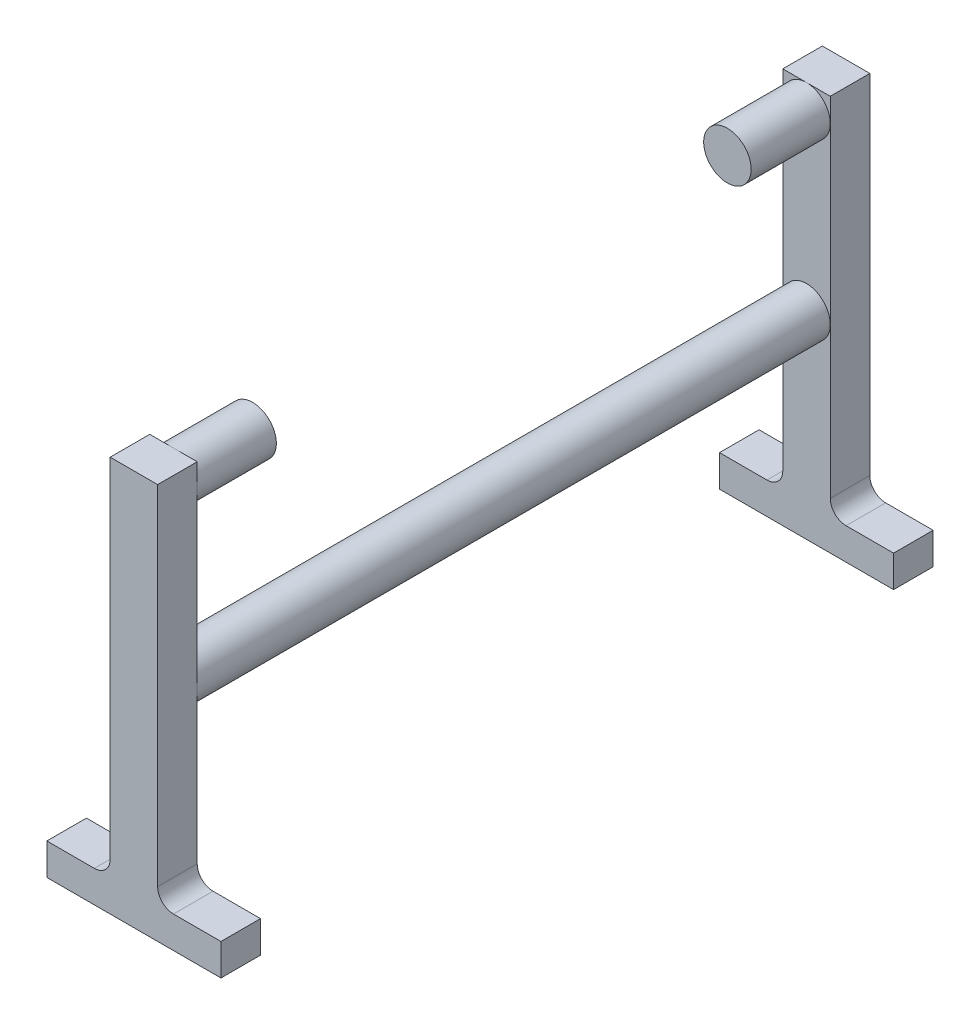
ISO-10303-21;
HEADER;
FILE_DESCRIPTION(('STEP AP214'),'2;1');
FILE_NAME('part.step','',(''),(''),'','','');
FILE_SCHEMA(('AUTOMOTIVE_DESIGN { 1 0 10303 214 1 1 1 1 }'));
ENDSEC;
DATA;
#1=APPLICATION_CONTEXT('core data for automotive mechanical design processes');
#2=APPLICATION_PROTOCOL_DEFINITION('international standard','automotive_design',2000,#1);
#3=PRODUCT_CONTEXT('',#1,'mechanical');
#4=PRODUCT('Part','Part','',(#3));
#5=PRODUCT_RELATED_PRODUCT_CATEGORY('part','',(#4));
#6=PRODUCT_DEFINITION_FORMATION('','',#4);
#7=PRODUCT_DEFINITION_CONTEXT('part definition',#1,'design');
#8=PRODUCT_DEFINITION('design','',#6,#7);
#9=PRODUCT_DEFINITION_SHAPE('','',#8);
#10=(LENGTH_UNIT() NAMED_UNIT(*) SI_UNIT(.MILLI.,.METRE.));
#11=(NAMED_UNIT(*) PLANE_ANGLE_UNIT() SI_UNIT($,.RADIAN.));
#12=(NAMED_UNIT(*) SI_UNIT($,.STERADIAN.) SOLID_ANGLE_UNIT());
#13=UNCERTAINTY_MEASURE_WITH_UNIT(LENGTH_MEASURE(1.E-05),#10,'distance_accuracy_value','');
#14=(GEOMETRIC_REPRESENTATION_CONTEXT(3) GLOBAL_UNCERTAINTY_ASSIGNED_CONTEXT((#13)) GLOBAL_UNIT_ASSIGNED_CONTEXT((#10,
#11,#12)) REPRESENTATION_CONTEXT('',''));
#15=CARTESIAN_POINT('',(0.,0.,0.));
#16=DIRECTION('',(0.,0.,1.));
#17=DIRECTION('',(1.,0.,0.));
#18=AXIS2_PLACEMENT_3D('',#15,#16,#17);
#19=CARTESIAN_POINT('',(0.,0.,-40.));
#20=DIRECTION('',(0.,0.,-1.));
#21=DIRECTION('',(1.,0.,0.));
#22=AXIS2_PLACEMENT_3D('',#19,#20,#21);
#23=PLANE('',#22);
#24=DIRECTION('',(0.,-1.,0.));
#25=VECTOR('',#24,1.);
#26=CARTESIAN_POINT('',(-3.,-25.,-40.));
#27=LINE('',#26,#25);
#28=CARTESIAN_POINT('',(-3.,25.,-40.));
#29=VERTEX_POINT('',#28);
#30=CARTESIAN_POINT('',(-3.,22.,-40.));
#31=VERTEX_POINT('',#30);
#32=EDGE_CURVE('E216',#29,#31,#27,.T.);
#33=ORIENTED_EDGE('',*,*,#32,.T.);
#34=CARTESIAN_POINT('',(0.,22.,-40.));
#35=DIRECTION('',(0.,0.,-1.));
#36=DIRECTION('',(-1.,0.,0.));
#37=AXIS2_PLACEMENT_3D('',#34,#35,#36);
#38=CIRCLE('',#37,3.);
#39=CARTESIAN_POINT('',(0.,25.,-40.));
#40=VERTEX_POINT('',#39);
#41=EDGE_CURVE('E54',#31,#40,#38,.T.);
#42=ORIENTED_EDGE('',*,*,#41,.T.);
#43=DIRECTION('',(-1.,0.,0.));
#44=VECTOR('',#43,1.);
#45=CARTESIAN_POINT('',(3.,25.,-40.));
#46=LINE('',#45,#44);
#47=EDGE_CURVE('E213',#40,#29,#46,.T.);
#48=ORIENTED_EDGE('',*,*,#47,.T.);
#49=EDGE_LOOP('',(#33,#42,#48));
#50=FACE_BOUND('',#49,.T.);
#51=ADVANCED_FACE('F39',(#50),#23,.F.);
#52=CARTESIAN_POINT('',(3.,25.,-40.));
#53=VERTEX_POINT('',#52);
#54=EDGE_CURVE('E222',#53,#40,#46,.T.);
#55=ORIENTED_EDGE('',*,*,#54,.T.);
#56=CARTESIAN_POINT('',(3.,22.,-40.));
#57=VERTEX_POINT('',#56);
#58=EDGE_CURVE('E203',#40,#57,#38,.T.);
#59=ORIENTED_EDGE('',*,*,#58,.T.);
#60=DIRECTION('',(0.,1.,0.));
#61=VECTOR('',#60,1.);
#62=CARTESIAN_POINT('',(3.,-25.,-40.));
#63=LINE('',#62,#61);
#64=EDGE_CURVE('E227',#57,#53,#63,.T.);
#65=ORIENTED_EDGE('',*,*,#64,.T.);
#66=EDGE_LOOP('',(#55,#59,#65));
#67=FACE_BOUND('',#66,.T.);
#68=ADVANCED_FACE('F226',(#67),#23,.F.);
#69=CARTESIAN_POINT('',(-3.,-25.,-45.));
#70=DIRECTION('',(-1.,0.,0.));
#71=DIRECTION('',(0.,0.,1.));
#72=AXIS2_PLACEMENT_3D('',#69,#70,#71);
#73=PLANE('',#72);
#74=DIRECTION('',(0.,-1.,0.));
#75=VECTOR('',#74,1.);
#76=CARTESIAN_POINT('',(-3.,-25.,-45.));
#77=LINE('',#76,#75);
#78=CARTESIAN_POINT('',(-3.,25.,-45.));
#79=VERTEX_POINT('',#78);
#80=CARTESIAN_POINT('',(-3.,-19.,-45.));
#81=VERTEX_POINT('',#80);
#82=EDGE_CURVE('E237',#79,#81,#77,.T.);
#83=ORIENTED_EDGE('',*,*,#82,.T.);
#84=DIRECTION('',(0.,0.,1.));
#85=VECTOR('',#84,1.);
#86=CARTESIAN_POINT('',(-3.,-19.,-45.));
#87=LINE('',#86,#85);
#88=CARTESIAN_POINT('',(-3.,-19.,-40.));
#89=VERTEX_POINT('',#88);
#90=EDGE_CURVE('E338',#81,#89,#87,.T.);
#91=ORIENTED_EDGE('',*,*,#90,.T.);
#92=CARTESIAN_POINT('',(-3.,0.,-40.));
#93=VERTEX_POINT('',#92);
#94=EDGE_CURVE('E377',#93,#89,#27,.T.);
#95=ORIENTED_EDGE('',*,*,#94,.F.);
#96=EDGE_CURVE('E825',#31,#93,#27,.T.);
#97=ORIENTED_EDGE('',*,*,#96,.F.);
#98=ORIENTED_EDGE('',*,*,#32,.F.);
#99=DIRECTION('',(0.,0.,1.));
#100=VECTOR('',#99,1.);
#101=CARTESIAN_POINT('',(-3.,25.,-45.));
#102=LINE('',#101,#100);
#103=EDGE_CURVE('E224',#79,#29,#102,.T.);
#104=ORIENTED_EDGE('',*,*,#103,.F.);
#105=EDGE_LOOP('',(#83,#91,#95,#97,#98,#104));
#106=FACE_BOUND('',#105,.T.);
#107=ADVANCED_FACE('F364',(#106),#73,.T.);
#108=CARTESIAN_POINT('',(3.,-25.,-45.));
#109=DIRECTION('',(1.,0.,0.));
#110=DIRECTION('',(0.,0.,-1.));
#111=AXIS2_PLACEMENT_3D('',#108,#109,#110);
#112=PLANE('',#111);
#113=CARTESIAN_POINT('',(3.,-19.,-40.));
#114=VERTEX_POINT('',#113);
#115=CARTESIAN_POINT('',(3.,0.,-40.));
#116=VERTEX_POINT('',#115);
#117=EDGE_CURVE('E231',#114,#116,#63,.T.);
#118=ORIENTED_EDGE('',*,*,#117,.F.);
#119=DIRECTION('',(0.,0.,-1.));
#120=VECTOR('',#119,1.);
#121=CARTESIAN_POINT('',(3.,-19.,-45.));
#122=LINE('',#121,#120);
#123=CARTESIAN_POINT('',(3.,-19.,-45.));
#124=VERTEX_POINT('',#123);
#125=EDGE_CURVE('E343',#114,#124,#122,.T.);
#126=ORIENTED_EDGE('',*,*,#125,.T.);
#127=DIRECTION('',(0.,1.,0.));
#128=VECTOR('',#127,1.);
#129=CARTESIAN_POINT('',(3.,-25.,-45.));
#130=LINE('',#129,#128);
#131=CARTESIAN_POINT('',(3.,25.,-45.));
#132=VERTEX_POINT('',#131);
#133=EDGE_CURVE('E406',#124,#132,#130,.T.);
#134=ORIENTED_EDGE('',*,*,#133,.T.);
#135=DIRECTION('',(0.,0.,1.));
#136=VECTOR('',#135,1.);
#137=CARTESIAN_POINT('',(3.,25.,-45.));
#138=LINE('',#137,#136);
#139=EDGE_CURVE('E238',#132,#53,#138,.T.);
#140=ORIENTED_EDGE('',*,*,#139,.T.);
#141=ORIENTED_EDGE('',*,*,#64,.F.);
#142=EDGE_CURVE('E229',#116,#57,#63,.T.);
#143=ORIENTED_EDGE('',*,*,#142,.F.);
#144=EDGE_LOOP('',(#118,#126,#134,#140,#141,#143));
#145=FACE_BOUND('',#144,.T.);
#146=ADVANCED_FACE('F465',(#145),#112,.T.);
#147=CARTESIAN_POINT('',(0.,0.,40.));
#148=DIRECTION('',(0.,0.,1.));
#149=DIRECTION('',(1.,0.,0.));
#150=AXIS2_PLACEMENT_3D('',#147,#148,#149);
#151=PLANE('',#150);
#152=CARTESIAN_POINT('',(0.,22.,40.));
#153=DIRECTION('',(0.,0.,-1.));
#154=DIRECTION('',(-1.,0.,0.));
#155=AXIS2_PLACEMENT_3D('',#152,#153,#154);
#156=CIRCLE('',#155,3.);
#157=CARTESIAN_POINT('',(3.,22.,40.));
#158=VERTEX_POINT('',#157);
#159=CARTESIAN_POINT('',(-3.,22.,40.));
#160=VERTEX_POINT('',#159);
#161=EDGE_CURVE('E242',#158,#160,#156,.T.);
#162=ORIENTED_EDGE('',*,*,#161,.F.);
#163=DIRECTION('',(0.,1.,0.));
#164=VECTOR('',#163,1.);
#165=CARTESIAN_POINT('',(3.,-25.,40.));
#166=LINE('',#165,#164);
#167=CARTESIAN_POINT('',(3.,0.,40.));
#168=VERTEX_POINT('',#167);
#169=EDGE_CURVE('E304',#168,#158,#166,.T.);
#170=ORIENTED_EDGE('',*,*,#169,.F.);
#171=CARTESIAN_POINT('',(0.,0.,40.));
#172=DIRECTION('',(0.,0.,1.));
#173=DIRECTION('',(1.,0.,0.));
#174=AXIS2_PLACEMENT_3D('',#171,#172,#173);
#175=CIRCLE('',#174,3.);
#176=CARTESIAN_POINT('',(-3.,0.,40.));
#177=VERTEX_POINT('',#176);
#178=EDGE_CURVE('E313',#168,#177,#175,.T.);
#179=ORIENTED_EDGE('',*,*,#178,.T.);
#180=DIRECTION('',(0.,-1.,0.));
#181=VECTOR('',#180,1.);
#182=CARTESIAN_POINT('',(-3.,-25.,40.));
#183=LINE('',#182,#181);
#184=EDGE_CURVE('E298',#160,#177,#183,.T.);
#185=ORIENTED_EDGE('',*,*,#184,.F.);
#186=EDGE_LOOP('',(#162,#170,#179,#185));
#187=FACE_BOUND('',#186,.T.);
#188=ADVANCED_FACE('F630',(#187),#151,.F.);
#189=CARTESIAN_POINT('',(0.,25.,40.));
#190=VERTEX_POINT('',#189);
#191=EDGE_CURVE('E247',#160,#190,#156,.T.);
#192=ORIENTED_EDGE('',*,*,#191,.F.);
#193=CARTESIAN_POINT('',(-3.,25.,40.));
#194=VERTEX_POINT('',#193);
#195=EDGE_CURVE('E294',#194,#160,#183,.T.);
#196=ORIENTED_EDGE('',*,*,#195,.F.);
#197=DIRECTION('',(-1.,0.,0.));
#198=VECTOR('',#197,1.);
#199=CARTESIAN_POINT('',(3.,25.,40.));
#200=LINE('',#199,#198);
#201=EDGE_CURVE('E303',#190,#194,#200,.T.);
#202=ORIENTED_EDGE('',*,*,#201,.F.);
#203=EDGE_LOOP('',(#192,#196,#202));
#204=FACE_BOUND('',#203,.T.);
#205=ADVANCED_FACE('F655',(#204),#151,.F.);
#206=CARTESIAN_POINT('',(-3.,-25.,45.));
#207=DIRECTION('',(1.,0.,0.));
#208=DIRECTION('',(0.,0.,-1.));
#209=AXIS2_PLACEMENT_3D('',#206,#207,#208);
#210=PLANE('',#209);
#211=CARTESIAN_POINT('',(-3.,-19.,40.));
#212=VERTEX_POINT('',#211);
#213=EDGE_CURVE('E274',#177,#212,#183,.T.);
#214=ORIENTED_EDGE('',*,*,#213,.T.);
#215=DIRECTION('',(0.,0.,-1.));
#216=VECTOR('',#215,1.);
#217=CARTESIAN_POINT('',(-3.,-19.,45.));
#218=LINE('',#217,#216);
#219=CARTESIAN_POINT('',(-3.,-19.,45.));
#220=VERTEX_POINT('',#219);
#221=EDGE_CURVE('E323',#212,#220,#218,.F.);
#222=ORIENTED_EDGE('',*,*,#221,.T.);
#223=DIRECTION('',(0.,-1.,0.));
#224=VECTOR('',#223,1.);
#225=CARTESIAN_POINT('',(-3.,-25.,45.));
#226=LINE('',#225,#224);
#227=CARTESIAN_POINT('',(-3.,25.,45.));
#228=VERTEX_POINT('',#227);
#229=EDGE_CURVE('E283',#228,#220,#226,.T.);
#230=ORIENTED_EDGE('',*,*,#229,.F.);
#231=DIRECTION('',(0.,0.,-1.));
#232=VECTOR('',#231,1.);
#233=CARTESIAN_POINT('',(-3.,25.,45.));
#234=LINE('',#233,#232);
#235=EDGE_CURVE('E293',#228,#194,#234,.T.);
#236=ORIENTED_EDGE('',*,*,#235,.T.);
#237=ORIENTED_EDGE('',*,*,#195,.T.);
#238=ORIENTED_EDGE('',*,*,#184,.T.);
#239=EDGE_LOOP('',(#214,#222,#230,#236,#237,#238));
#240=FACE_BOUND('',#239,.T.);
#241=ADVANCED_FACE('F644',(#240),#210,.F.);
#242=CARTESIAN_POINT('',(3.,-25.,45.));
#243=DIRECTION('',(-1.,0.,0.));
#244=DIRECTION('',(0.,0.,1.));
#245=AXIS2_PLACEMENT_3D('',#242,#243,#244);
#246=PLANE('',#245);
#247=DIRECTION('',(0.,1.,0.));
#248=VECTOR('',#247,1.);
#249=CARTESIAN_POINT('',(3.,-25.,45.));
#250=LINE('',#249,#248);
#251=CARTESIAN_POINT('',(3.,-19.,45.));
#252=VERTEX_POINT('',#251);
#253=CARTESIAN_POINT('',(3.,25.,45.));
#254=VERTEX_POINT('',#253);
#255=EDGE_CURVE('E289',#252,#254,#250,.T.);
#256=ORIENTED_EDGE('',*,*,#255,.F.);
#257=DIRECTION('',(0.,0.,1.));
#258=VECTOR('',#257,1.);
#259=CARTESIAN_POINT('',(3.,-19.,40.));
#260=LINE('',#259,#258);
#261=CARTESIAN_POINT('',(3.,-19.,40.));
#262=VERTEX_POINT('',#261);
#263=EDGE_CURVE('E328',#252,#262,#260,.F.);
#264=ORIENTED_EDGE('',*,*,#263,.T.);
#265=EDGE_CURVE('E301',#262,#168,#166,.T.);
#266=ORIENTED_EDGE('',*,*,#265,.T.);
#267=ORIENTED_EDGE('',*,*,#169,.T.);
#268=CARTESIAN_POINT('',(3.,25.,40.));
#269=VERTEX_POINT('',#268);
#270=EDGE_CURVE('E300',#158,#269,#166,.T.);
#271=ORIENTED_EDGE('',*,*,#270,.T.);
#272=DIRECTION('',(0.,0.,-1.));
#273=VECTOR('',#272,1.);
#274=CARTESIAN_POINT('',(3.,25.,45.));
#275=LINE('',#274,#273);
#276=EDGE_CURVE('E309',#254,#269,#275,.T.);
#277=ORIENTED_EDGE('',*,*,#276,.F.);
#278=EDGE_LOOP('',(#256,#264,#266,#267,#271,#277));
#279=FACE_BOUND('',#278,.T.);
#280=ADVANCED_FACE('F639',(#279),#246,.F.);
#281=CARTESIAN_POINT('',(0.,0.,40.));
#282=DIRECTION('',(0.,0.,-1.));
#283=DIRECTION('',(-1.,0.,0.));
#284=AXIS2_PLACEMENT_3D('',#281,#282,#283);
#285=CYLINDRICAL_SURFACE('',#284,3.);
#286=ORIENTED_EDGE('',*,*,#178,.F.);
#287=EDGE_CURVE('E317',#177,#168,#175,.T.);
#288=ORIENTED_EDGE('',*,*,#287,.F.);
#289=EDGE_LOOP('',(#286,#288));
#290=FACE_BOUND('',#289,.T.);
#291=CARTESIAN_POINT('',(0.,0.,-40.));
#292=DIRECTION('',(0.,0.,1.));
#293=DIRECTION('',(1.,0.,0.));
#294=AXIS2_PLACEMENT_3D('',#291,#292,#293);
#295=CIRCLE('',#294,3.);
#296=EDGE_CURVE('E318',#116,#93,#295,.T.);
#297=ORIENTED_EDGE('',*,*,#296,.T.);
#298=EDGE_CURVE('E312',#93,#116,#295,.T.);
#299=ORIENTED_EDGE('',*,*,#298,.T.);
#300=EDGE_LOOP('',(#297,#299));
#301=FACE_BOUND('',#300,.T.);
#302=ADVANCED_FACE('F627',(#290,#301),#285,.T.);
#303=EDGE_CURVE('E250',#190,#158,#156,.T.);
#304=ORIENTED_EDGE('',*,*,#303,.F.);
#305=EDGE_CURVE('E287',#269,#190,#200,.T.);
#306=ORIENTED_EDGE('',*,*,#305,.F.);
#307=ORIENTED_EDGE('',*,*,#270,.F.);
#308=EDGE_LOOP('',(#304,#306,#307));
#309=FACE_BOUND('',#308,.T.);
#310=ADVANCED_FACE('F621',(#309),#151,.F.);
#311=DIRECTION('',(1.,0.,0.));
#312=VECTOR('',#311,1.);
#313=CARTESIAN_POINT('',(3.,-25.,40.));
#314=LINE('',#313,#312);
#315=CARTESIAN_POINT('',(-11.,-25.,40.));
#316=VERTEX_POINT('',#315);
#317=CARTESIAN_POINT('',(11.,-25.,40.));
#318=VERTEX_POINT('',#317);
#319=EDGE_CURVE('E297',#316,#318,#314,.T.);
#320=ORIENTED_EDGE('',*,*,#319,.F.);
#321=DIRECTION('',(0.,-1.,0.));
#322=VECTOR('',#321,1.);
#323=CARTESIAN_POINT('',(-11.,-21.,40.));
#324=LINE('',#323,#322);
#325=CARTESIAN_POINT('',(-11.,-21.,40.));
#326=VERTEX_POINT('',#325);
#327=EDGE_CURVE('E266',#326,#316,#324,.T.);
#328=ORIENTED_EDGE('',*,*,#327,.F.);
#329=DIRECTION('',(1.,0.,0.));
#330=VECTOR('',#329,1.);
#331=CARTESIAN_POINT('',(11.,-21.,40.));
#332=LINE('',#331,#330);
#333=CARTESIAN_POINT('',(-5.,-21.,40.));
#334=VERTEX_POINT('',#333);
#335=EDGE_CURVE('E256',#326,#334,#332,.T.);
#336=ORIENTED_EDGE('',*,*,#335,.T.);
#337=CARTESIAN_POINT('',(-5.,-19.,40.));
#338=DIRECTION('',(0.,0.,1.));
#339=DIRECTION('',(1.,0.,0.));
#340=AXIS2_PLACEMENT_3D('',#337,#338,#339);
#341=CIRCLE('',#340,2.);
#342=EDGE_CURVE('E330',#334,#212,#341,.T.);
#343=ORIENTED_EDGE('',*,*,#342,.T.);
#344=ORIENTED_EDGE('',*,*,#213,.F.);
#345=ORIENTED_EDGE('',*,*,#287,.T.);
#346=ORIENTED_EDGE('',*,*,#265,.F.);
#347=CARTESIAN_POINT('',(5.,-19.,40.));
#348=DIRECTION('',(0.,0.,1.));
#349=DIRECTION('',(1.,0.,0.));
#350=AXIS2_PLACEMENT_3D('',#347,#348,#349);
#351=CIRCLE('',#350,2.);
#352=CARTESIAN_POINT('',(5.,-21.,40.));
#353=VERTEX_POINT('',#352);
#354=EDGE_CURVE('E336',#262,#353,#351,.T.);
#355=ORIENTED_EDGE('',*,*,#354,.T.);
#356=CARTESIAN_POINT('',(11.,-21.,40.));
#357=VERTEX_POINT('',#356);
#358=EDGE_CURVE('E254',#353,#357,#332,.T.);
#359=ORIENTED_EDGE('',*,*,#358,.T.);
#360=DIRECTION('',(0.,-1.,0.));
#361=VECTOR('',#360,1.);
#362=CARTESIAN_POINT('',(11.,-21.,40.));
#363=LINE('',#362,#361);
#364=EDGE_CURVE('E278',#357,#318,#363,.T.);
#365=ORIENTED_EDGE('',*,*,#364,.T.);
#366=EDGE_LOOP('',(#320,#328,#336,#343,#344,#345,#346,#355,#359,#365));
#367=FACE_BOUND('',#366,.T.);
#368=ADVANCED_FACE('F626',(#367),#151,.F.);
#369=CARTESIAN_POINT('',(3.,-25.,45.));
#370=DIRECTION('',(0.,1.,0.));
#371=DIRECTION('',(0.,0.,1.));
#372=AXIS2_PLACEMENT_3D('',#369,#370,#371);
#373=PLANE('',#372);
#374=ORIENTED_EDGE('',*,*,#319,.T.);
#375=DIRECTION('',(0.,0.,1.));
#376=VECTOR('',#375,1.);
#377=CARTESIAN_POINT('',(11.,-25.,40.));
#378=LINE('',#377,#376);
#379=CARTESIAN_POINT('',(11.,-25.,45.));
#380=VERTEX_POINT('',#379);
#381=EDGE_CURVE('E255',#318,#380,#378,.T.);
#382=ORIENTED_EDGE('',*,*,#381,.T.);
#383=DIRECTION('',(1.,0.,0.));
#384=VECTOR('',#383,1.);
#385=CARTESIAN_POINT('',(3.,-25.,45.));
#386=LINE('',#385,#384);
#387=CARTESIAN_POINT('',(-11.,-25.,45.));
#388=VERTEX_POINT('',#387);
#389=EDGE_CURVE('E286',#388,#380,#386,.T.);
#390=ORIENTED_EDGE('',*,*,#389,.F.);
#391=DIRECTION('',(0.,0.,-1.));
#392=VECTOR('',#391,1.);
#393=CARTESIAN_POINT('',(-11.,-25.,40.));
#394=LINE('',#393,#392);
#395=EDGE_CURVE('E246',#388,#316,#394,.T.);
#396=ORIENTED_EDGE('',*,*,#395,.T.);
#397=EDGE_LOOP('',(#374,#382,#390,#396));
#398=FACE_BOUND('',#397,.T.);
#399=ADVANCED_FACE('F610',(#398),#373,.F.);
#400=CARTESIAN_POINT('',(3.,25.,45.));
#401=DIRECTION('',(0.,-1.,0.));
#402=DIRECTION('',(0.,0.,-1.));
#403=AXIS2_PLACEMENT_3D('',#400,#401,#402);
#404=PLANE('',#403);
#405=ORIENTED_EDGE('',*,*,#305,.T.);
#406=ORIENTED_EDGE('',*,*,#201,.T.);
#407=ORIENTED_EDGE('',*,*,#235,.F.);
#408=DIRECTION('',(-1.,0.,0.));
#409=VECTOR('',#408,1.);
#410=CARTESIAN_POINT('',(3.,25.,45.));
#411=LINE('',#410,#409);
#412=EDGE_CURVE('E291',#254,#228,#411,.T.);
#413=ORIENTED_EDGE('',*,*,#412,.F.);
#414=ORIENTED_EDGE('',*,*,#276,.T.);
#415=EDGE_LOOP('',(#405,#406,#407,#413,#414));
#416=FACE_BOUND('',#415,.T.);
#417=ADVANCED_FACE('F604',(#416),#404,.F.);
#418=CARTESIAN_POINT('',(0.,0.,45.));
#419=DIRECTION('',(0.,0.,1.));
#420=DIRECTION('',(1.,0.,0.));
#421=AXIS2_PLACEMENT_3D('',#418,#419,#420);
#422=PLANE('',#421);
#423=ORIENTED_EDGE('',*,*,#389,.T.);
#424=DIRECTION('',(0.,-1.,0.));
#425=VECTOR('',#424,1.);
#426=CARTESIAN_POINT('',(11.,-21.,45.));
#427=LINE('',#426,#425);
#428=CARTESIAN_POINT('',(11.,-21.,45.));
#429=VERTEX_POINT('',#428);
#430=EDGE_CURVE('E275',#429,#380,#427,.T.);
#431=ORIENTED_EDGE('',*,*,#430,.F.);
#432=DIRECTION('',(-1.,0.,0.));
#433=VECTOR('',#432,1.);
#434=CARTESIAN_POINT('',(11.,-21.,45.));
#435=LINE('',#434,#433);
#436=CARTESIAN_POINT('',(5.,-21.,45.));
#437=VERTEX_POINT('',#436);
#438=EDGE_CURVE('E263',#429,#437,#435,.T.);
#439=ORIENTED_EDGE('',*,*,#438,.T.);
#440=CARTESIAN_POINT('',(5.,-19.,45.));
#441=DIRECTION('',(0.,0.,1.));
#442=DIRECTION('',(1.,0.,0.));
#443=AXIS2_PLACEMENT_3D('',#440,#441,#442);
#444=CIRCLE('',#443,2.);
#445=EDGE_CURVE('E334',#437,#252,#444,.F.);
#446=ORIENTED_EDGE('',*,*,#445,.T.);
#447=ORIENTED_EDGE('',*,*,#255,.T.);
#448=ORIENTED_EDGE('',*,*,#412,.T.);
#449=ORIENTED_EDGE('',*,*,#229,.T.);
#450=CARTESIAN_POINT('',(-5.,-19.,45.));
#451=DIRECTION('',(0.,0.,1.));
#452=DIRECTION('',(1.,0.,0.));
#453=AXIS2_PLACEMENT_3D('',#450,#451,#452);
#454=CIRCLE('',#453,2.);
#455=CARTESIAN_POINT('',(-5.,-21.,45.));
#456=VERTEX_POINT('',#455);
#457=EDGE_CURVE('E332',#220,#456,#454,.F.);
#458=ORIENTED_EDGE('',*,*,#457,.T.);
#459=CARTESIAN_POINT('',(-11.,-21.,45.));
#460=VERTEX_POINT('',#459);
#461=EDGE_CURVE('E262',#456,#460,#435,.T.);
#462=ORIENTED_EDGE('',*,*,#461,.T.);
#463=DIRECTION('',(0.,-1.,0.));
#464=VECTOR('',#463,1.);
#465=CARTESIAN_POINT('',(-11.,-21.,45.));
#466=LINE('',#465,#464);
#467=EDGE_CURVE('E271',#460,#388,#466,.T.);
#468=ORIENTED_EDGE('',*,*,#467,.T.);
#469=EDGE_LOOP('',(#423,#431,#439,#446,#447,#448,#449,#458,#462,#468));
#470=FACE_BOUND('',#469,.T.);
#471=ADVANCED_FACE('F609',(#470),#422,.T.);
#472=CARTESIAN_POINT('',(11.,-21.,40.));
#473=DIRECTION('',(1.,0.,0.));
#474=DIRECTION('',(0.,0.,-1.));
#475=AXIS2_PLACEMENT_3D('',#472,#473,#474);
#476=PLANE('',#475);
#477=ORIENTED_EDGE('',*,*,#381,.F.);
#478=ORIENTED_EDGE('',*,*,#364,.F.);
#479=DIRECTION('',(0.,0.,1.));
#480=VECTOR('',#479,1.);
#481=CARTESIAN_POINT('',(11.,-21.,40.));
#482=LINE('',#481,#480);
#483=EDGE_CURVE('E259',#357,#429,#482,.T.);
#484=ORIENTED_EDGE('',*,*,#483,.T.);
#485=ORIENTED_EDGE('',*,*,#430,.T.);
#486=EDGE_LOOP('',(#477,#478,#484,#485));
#487=FACE_BOUND('',#486,.T.);
#488=ADVANCED_FACE('F718',(#487),#476,.T.);
#489=CARTESIAN_POINT('',(0.,-21.,0.));
#490=DIRECTION('',(0.,-1.,0.));
#491=DIRECTION('',(0.,0.,-1.));
#492=AXIS2_PLACEMENT_3D('',#489,#490,#491);
#493=PLANE('',#492);
#494=ORIENTED_EDGE('',*,*,#358,.F.);
#495=DIRECTION('',(0.,0.,1.));
#496=VECTOR('',#495,1.);
#497=CARTESIAN_POINT('',(5.,-21.,45.));
#498=LINE('',#497,#496);
#499=EDGE_CURVE('E325',#353,#437,#498,.T.);
#500=ORIENTED_EDGE('',*,*,#499,.T.);
#501=ORIENTED_EDGE('',*,*,#438,.F.);
#502=ORIENTED_EDGE('',*,*,#483,.F.);
#503=EDGE_LOOP('',(#494,#500,#501,#502));
#504=FACE_BOUND('',#503,.T.);
#505=ADVANCED_FACE('F707',(#504),#493,.F.);
#506=ORIENTED_EDGE('',*,*,#461,.F.);
#507=DIRECTION('',(0.,0.,-1.));
#508=VECTOR('',#507,1.);
#509=CARTESIAN_POINT('',(-5.,-21.,40.));
#510=LINE('',#509,#508);
#511=EDGE_CURVE('E316',#456,#334,#510,.T.);
#512=ORIENTED_EDGE('',*,*,#511,.T.);
#513=ORIENTED_EDGE('',*,*,#335,.F.);
#514=DIRECTION('',(0.,0.,-1.));
#515=VECTOR('',#514,1.);
#516=CARTESIAN_POINT('',(-11.,-21.,40.));
#517=LINE('',#516,#515);
#518=EDGE_CURVE('E251',#460,#326,#517,.T.);
#519=ORIENTED_EDGE('',*,*,#518,.F.);
#520=EDGE_LOOP('',(#506,#512,#513,#519));
#521=FACE_BOUND('',#520,.T.);
#522=ADVANCED_FACE('F702',(#521),#493,.F.);
#523=CARTESIAN_POINT('',(-11.,-21.,40.));
#524=DIRECTION('',(-1.,0.,0.));
#525=DIRECTION('',(0.,0.,1.));
#526=AXIS2_PLACEMENT_3D('',#523,#524,#525);
#527=PLANE('',#526);
#528=ORIENTED_EDGE('',*,*,#395,.F.);
#529=ORIENTED_EDGE('',*,*,#467,.F.);
#530=ORIENTED_EDGE('',*,*,#518,.T.);
#531=ORIENTED_EDGE('',*,*,#327,.T.);
#532=EDGE_LOOP('',(#528,#529,#530,#531));
#533=FACE_BOUND('',#532,.T.);
#534=ADVANCED_FACE('F693',(#533),#527,.T.);
#535=CARTESIAN_POINT('',(-5.,-19.,0.));
#536=DIRECTION('',(0.,0.,1.));
#537=DIRECTION('',(1.,0.,0.));
#538=AXIS2_PLACEMENT_3D('',#535,#536,#537);
#539=CYLINDRICAL_SURFACE('',#538,2.);
#540=ORIENTED_EDGE('',*,*,#457,.F.);
#541=ORIENTED_EDGE('',*,*,#221,.F.);
#542=ORIENTED_EDGE('',*,*,#342,.F.);
#543=ORIENTED_EDGE('',*,*,#511,.F.);
#544=EDGE_LOOP('',(#540,#541,#542,#543));
#545=FACE_BOUND('',#544,.T.);
#546=ADVANCED_FACE('F683',(#545),#539,.F.);
#547=CARTESIAN_POINT('',(5.,-19.,0.));
#548=DIRECTION('',(0.,0.,-1.));
#549=DIRECTION('',(-1.,0.,0.));
#550=AXIS2_PLACEMENT_3D('',#547,#548,#549);
#551=CYLINDRICAL_SURFACE('',#550,2.);
#552=ORIENTED_EDGE('',*,*,#354,.F.);
#553=ORIENTED_EDGE('',*,*,#263,.F.);
#554=ORIENTED_EDGE('',*,*,#445,.F.);
#555=ORIENTED_EDGE('',*,*,#499,.F.);
#556=EDGE_LOOP('',(#552,#553,#554,#555));
#557=FACE_BOUND('',#556,.T.);
#558=ADVANCED_FACE('F595',(#557),#551,.F.);
#559=CARTESIAN_POINT('',(0.,22.,30.));
#560=DIRECTION('',(0.,0.,1.));
#561=DIRECTION('',(1.,0.,0.));
#562=AXIS2_PLACEMENT_3D('',#559,#560,#561);
#563=CYLINDRICAL_SURFACE('',#562,3.);
#564=CARTESIAN_POINT('',(0.,22.,30.));
#565=DIRECTION('',(0.,0.,-1.));
#566=DIRECTION('',(-1.,0.,0.));
#567=AXIS2_PLACEMENT_3D('',#564,#565,#566);
#568=CIRCLE('',#567,3.);
#569=CARTESIAN_POINT('',(-3.,22.,30.));
#570=VERTEX_POINT('',#569);
#571=EDGE_CURVE('E243',#570,#570,#568,.T.);
#572=ORIENTED_EDGE('',*,*,#571,.F.);
#573=EDGE_LOOP('',(#572));
#574=FACE_BOUND('',#573,.T.);
#575=ORIENTED_EDGE('',*,*,#191,.T.);
#576=ORIENTED_EDGE('',*,*,#303,.T.);
#577=ORIENTED_EDGE('',*,*,#161,.T.);
#578=EDGE_LOOP('',(#575,#576,#577));
#579=FACE_BOUND('',#578,.T.);
#580=ADVANCED_FACE('F455',(#574,#579),#563,.T.);
#581=CARTESIAN_POINT('',(0.,22.,30.));
#582=DIRECTION('',(0.,0.,-1.));
#583=DIRECTION('',(-1.,0.,0.));
#584=AXIS2_PLACEMENT_3D('',#581,#582,#583);
#585=PLANE('',#584);
#586=ORIENTED_EDGE('',*,*,#571,.T.);
#587=EDGE_LOOP('',(#586));
#588=FACE_BOUND('',#587,.T.);
#589=ADVANCED_FACE('F448',(#588),#585,.T.);
#590=ORIENTED_EDGE('',*,*,#142,.T.);
#591=EDGE_CURVE('E205',#57,#31,#38,.T.);
#592=ORIENTED_EDGE('',*,*,#591,.T.);
#593=ORIENTED_EDGE('',*,*,#96,.T.);
#594=ORIENTED_EDGE('',*,*,#296,.F.);
#595=EDGE_LOOP('',(#590,#592,#593,#594));
#596=FACE_BOUND('',#595,.T.);
#597=ADVANCED_FACE('F437',(#596),#23,.F.);
#598=CARTESIAN_POINT('',(3.,25.,-45.));
#599=DIRECTION('',(0.,1.,0.));
#600=DIRECTION('',(0.,0.,1.));
#601=AXIS2_PLACEMENT_3D('',#598,#599,#600);
#602=PLANE('',#601);
#603=ORIENTED_EDGE('',*,*,#54,.F.);
#604=ORIENTED_EDGE('',*,*,#139,.F.);
#605=DIRECTION('',(-1.,0.,0.));
#606=VECTOR('',#605,1.);
#607=CARTESIAN_POINT('',(3.,25.,-45.));
#608=LINE('',#607,#606);
#609=EDGE_CURVE('E367',#132,#79,#608,.T.);
#610=ORIENTED_EDGE('',*,*,#609,.T.);
#611=ORIENTED_EDGE('',*,*,#103,.T.);
#612=ORIENTED_EDGE('',*,*,#47,.F.);
#613=EDGE_LOOP('',(#603,#604,#610,#611,#612));
#614=FACE_BOUND('',#613,.T.);
#615=ADVANCED_FACE('F220',(#614),#602,.T.);
#616=CARTESIAN_POINT('',(3.,-25.,-45.));
#617=DIRECTION('',(0.,-1.,0.));
#618=DIRECTION('',(0.,0.,-1.));
#619=AXIS2_PLACEMENT_3D('',#616,#617,#618);
#620=PLANE('',#619);
#621=DIRECTION('',(0.,0.,-1.));
#622=VECTOR('',#621,1.);
#623=CARTESIAN_POINT('',(11.,-25.,-40.));
#624=LINE('',#623,#622);
#625=CARTESIAN_POINT('',(11.,-25.,-40.));
#626=VERTEX_POINT('',#625);
#627=CARTESIAN_POINT('',(11.,-25.,-45.));
#628=VERTEX_POINT('',#627);
#629=EDGE_CURVE('E396',#626,#628,#624,.T.);
#630=ORIENTED_EDGE('',*,*,#629,.F.);
#631=DIRECTION('',(1.,0.,0.));
#632=VECTOR('',#631,1.);
#633=CARTESIAN_POINT('',(3.,-25.,-40.));
#634=LINE('',#633,#632);
#635=CARTESIAN_POINT('',(-11.,-25.,-40.));
#636=VERTEX_POINT('',#635);
#637=EDGE_CURVE('E235',#636,#626,#634,.T.);
#638=ORIENTED_EDGE('',*,*,#637,.F.);
#639=DIRECTION('',(0.,0.,1.));
#640=VECTOR('',#639,1.);
#641=CARTESIAN_POINT('',(-11.,-25.,-40.));
#642=LINE('',#641,#640);
#643=CARTESIAN_POINT('',(-11.,-25.,-45.));
#644=VERTEX_POINT('',#643);
#645=EDGE_CURVE('E393',#644,#636,#642,.T.);
#646=ORIENTED_EDGE('',*,*,#645,.F.);
#647=DIRECTION('',(1.,0.,0.));
#648=VECTOR('',#647,1.);
#649=CARTESIAN_POINT('',(3.,-25.,-45.));
#650=LINE('',#649,#648);
#651=EDGE_CURVE('E240',#644,#628,#650,.T.);
#652=ORIENTED_EDGE('',*,*,#651,.T.);
#653=EDGE_LOOP('',(#630,#638,#646,#652));
#654=FACE_BOUND('',#653,.T.);
#655=ADVANCED_FACE('F410',(#654),#620,.T.);
#656=CARTESIAN_POINT('',(0.,0.,-45.));
#657=DIRECTION('',(0.,0.,-1.));
#658=DIRECTION('',(1.,0.,0.));
#659=AXIS2_PLACEMENT_3D('',#656,#657,#658);
#660=PLANE('',#659);
#661=DIRECTION('',(0.,-1.,0.));
#662=VECTOR('',#661,1.);
#663=CARTESIAN_POINT('',(11.,-21.,-45.));
#664=LINE('',#663,#662);
#665=CARTESIAN_POINT('',(11.,-21.,-45.));
#666=VERTEX_POINT('',#665);
#667=EDGE_CURVE('E387',#666,#628,#664,.T.);
#668=ORIENTED_EDGE('',*,*,#667,.T.);
#669=ORIENTED_EDGE('',*,*,#651,.F.);
#670=DIRECTION('',(0.,-1.,0.));
#671=VECTOR('',#670,1.);
#672=CARTESIAN_POINT('',(-11.,-21.,-45.));
#673=LINE('',#672,#671);
#674=CARTESIAN_POINT('',(-11.,-21.,-45.));
#675=VERTEX_POINT('',#674);
#676=EDGE_CURVE('E383',#675,#644,#673,.T.);
#677=ORIENTED_EDGE('',*,*,#676,.F.);
#678=DIRECTION('',(-1.,0.,0.));
#679=VECTOR('',#678,1.);
#680=CARTESIAN_POINT('',(11.,-21.,-45.));
#681=LINE('',#680,#679);
#682=CARTESIAN_POINT('',(-5.,-21.,-45.));
#683=VERTEX_POINT('',#682);
#684=EDGE_CURVE('E359',#683,#675,#681,.T.);
#685=ORIENTED_EDGE('',*,*,#684,.F.);
#686=CARTESIAN_POINT('',(-5.,-19.,-45.));
#687=DIRECTION('',(0.,0.,-1.));
#688=DIRECTION('',(-1.,0.,0.));
#689=AXIS2_PLACEMENT_3D('',#686,#687,#688);
#690=CIRCLE('',#689,2.);
#691=EDGE_CURVE('E350',#683,#81,#690,.F.);
#692=ORIENTED_EDGE('',*,*,#691,.T.);
#693=ORIENTED_EDGE('',*,*,#82,.F.);
#694=ORIENTED_EDGE('',*,*,#609,.F.);
#695=ORIENTED_EDGE('',*,*,#133,.F.);
#696=CARTESIAN_POINT('',(5.,-19.,-45.));
#697=DIRECTION('',(0.,0.,-1.));
#698=DIRECTION('',(-1.,0.,0.));
#699=AXIS2_PLACEMENT_3D('',#696,#697,#698);
#700=CIRCLE('',#699,2.);
#701=CARTESIAN_POINT('',(5.,-21.,-45.));
#702=VERTEX_POINT('',#701);
#703=EDGE_CURVE('E47',#124,#702,#700,.F.);
#704=ORIENTED_EDGE('',*,*,#703,.T.);
#705=EDGE_CURVE('E416',#666,#702,#681,.T.);
#706=ORIENTED_EDGE('',*,*,#705,.F.);
#707=EDGE_LOOP('',(#668,#669,#677,#685,#692,#693,#694,#695,#704,#706));
#708=FACE_BOUND('',#707,.T.);
#709=ADVANCED_FACE('F356',(#708),#660,.T.);
#710=CARTESIAN_POINT('',(5.,-19.,-40.));
#711=DIRECTION('',(0.,0.,-1.));
#712=DIRECTION('',(-1.,0.,0.));
#713=AXIS2_PLACEMENT_3D('',#710,#711,#712);
#714=CIRCLE('',#713,2.);
#715=CARTESIAN_POINT('',(5.,-21.,-40.));
#716=VERTEX_POINT('',#715);
#717=EDGE_CURVE('E11',#716,#114,#714,.T.);
#718=ORIENTED_EDGE('',*,*,#717,.T.);
#719=ORIENTED_EDGE('',*,*,#117,.T.);
#720=ORIENTED_EDGE('',*,*,#298,.F.);
#721=ORIENTED_EDGE('',*,*,#94,.T.);
#722=CARTESIAN_POINT('',(-5.,-19.,-40.));
#723=DIRECTION('',(0.,0.,-1.));
#724=DIRECTION('',(-1.,0.,0.));
#725=AXIS2_PLACEMENT_3D('',#722,#723,#724);
#726=CIRCLE('',#725,2.);
#727=CARTESIAN_POINT('',(-5.,-21.,-40.));
#728=VERTEX_POINT('',#727);
#729=EDGE_CURVE('E348',#89,#728,#726,.T.);
#730=ORIENTED_EDGE('',*,*,#729,.T.);
#731=DIRECTION('',(1.,0.,0.));
#732=VECTOR('',#731,1.);
#733=CARTESIAN_POINT('',(11.,-21.,-40.));
#734=LINE('',#733,#732);
#735=CARTESIAN_POINT('',(-11.,-21.,-40.));
#736=VERTEX_POINT('',#735);
#737=EDGE_CURVE('E374',#736,#728,#734,.T.);
#738=ORIENTED_EDGE('',*,*,#737,.F.);
#739=DIRECTION('',(0.,-1.,0.));
#740=VECTOR('',#739,1.);
#741=CARTESIAN_POINT('',(-11.,-21.,-40.));
#742=LINE('',#741,#740);
#743=EDGE_CURVE('E399',#736,#636,#742,.T.);
#744=ORIENTED_EDGE('',*,*,#743,.T.);
#745=ORIENTED_EDGE('',*,*,#637,.T.);
#746=DIRECTION('',(0.,-1.,0.));
#747=VECTOR('',#746,1.);
#748=CARTESIAN_POINT('',(11.,-21.,-40.));
#749=LINE('',#748,#747);
#750=CARTESIAN_POINT('',(11.,-21.,-40.));
#751=VERTEX_POINT('',#750);
#752=EDGE_CURVE('E401',#751,#626,#749,.T.);
#753=ORIENTED_EDGE('',*,*,#752,.F.);
#754=EDGE_CURVE('E384',#716,#751,#734,.T.);
#755=ORIENTED_EDGE('',*,*,#754,.F.);
#756=EDGE_LOOP('',(#718,#719,#720,#721,#730,#738,#744,#745,#753,#755));
#757=FACE_BOUND('',#756,.T.);
#758=ADVANCED_FACE('F372',(#757),#23,.F.);
#759=CARTESIAN_POINT('',(11.,-21.,-40.));
#760=DIRECTION('',(-1.,0.,0.));
#761=DIRECTION('',(0.,0.,1.));
#762=AXIS2_PLACEMENT_3D('',#759,#760,#761);
#763=PLANE('',#762);
#764=ORIENTED_EDGE('',*,*,#629,.T.);
#765=ORIENTED_EDGE('',*,*,#667,.F.);
#766=DIRECTION('',(0.,0.,-1.));
#767=VECTOR('',#766,1.);
#768=CARTESIAN_POINT('',(11.,-21.,-40.));
#769=LINE('',#768,#767);
#770=EDGE_CURVE('E389',#751,#666,#769,.T.);
#771=ORIENTED_EDGE('',*,*,#770,.F.);
#772=ORIENTED_EDGE('',*,*,#752,.T.);
#773=EDGE_LOOP('',(#764,#765,#771,#772));
#774=FACE_BOUND('',#773,.T.);
#775=ADVANCED_FACE('F413',(#774),#763,.F.);
#776=CARTESIAN_POINT('',(0.,-21.,0.));
#777=DIRECTION('',(0.,-1.,0.));
#778=DIRECTION('',(0.,0.,1.));
#779=AXIS2_PLACEMENT_3D('',#776,#777,#778);
#780=PLANE('',#779);
#781=ORIENTED_EDGE('',*,*,#705,.T.);
#782=DIRECTION('',(0.,0.,-1.));
#783=VECTOR('',#782,1.);
#784=CARTESIAN_POINT('',(5.,-21.,0.));
#785=LINE('',#784,#783);
#786=EDGE_CURVE('E346',#702,#716,#785,.F.);
#787=ORIENTED_EDGE('',*,*,#786,.T.);
#788=ORIENTED_EDGE('',*,*,#754,.T.);
#789=ORIENTED_EDGE('',*,*,#770,.T.);
#790=EDGE_LOOP('',(#781,#787,#788,#789));
#791=FACE_BOUND('',#790,.T.);
#792=ADVANCED_FACE('F445',(#791),#780,.F.);
#793=ORIENTED_EDGE('',*,*,#737,.T.);
#794=DIRECTION('',(0.,0.,1.));
#795=VECTOR('',#794,1.);
#796=CARTESIAN_POINT('',(-5.,-21.,0.));
#797=LINE('',#796,#795);
#798=EDGE_CURVE('E341',#728,#683,#797,.F.);
#799=ORIENTED_EDGE('',*,*,#798,.T.);
#800=ORIENTED_EDGE('',*,*,#684,.T.);
#801=DIRECTION('',(0.,0.,1.));
#802=VECTOR('',#801,1.);
#803=CARTESIAN_POINT('',(-11.,-21.,-40.));
#804=LINE('',#803,#802);
#805=EDGE_CURVE('E381',#675,#736,#804,.T.);
#806=ORIENTED_EDGE('',*,*,#805,.T.);
#807=EDGE_LOOP('',(#793,#799,#800,#806));
#808=FACE_BOUND('',#807,.T.);
#809=ADVANCED_FACE('F379',(#808),#780,.F.);
#810=CARTESIAN_POINT('',(-11.,-21.,-40.));
#811=DIRECTION('',(1.,0.,0.));
#812=DIRECTION('',(0.,0.,-1.));
#813=AXIS2_PLACEMENT_3D('',#810,#811,#812);
#814=PLANE('',#813);
#815=ORIENTED_EDGE('',*,*,#645,.T.);
#816=ORIENTED_EDGE('',*,*,#743,.F.);
#817=ORIENTED_EDGE('',*,*,#805,.F.);
#818=ORIENTED_EDGE('',*,*,#676,.T.);
#819=EDGE_LOOP('',(#815,#816,#817,#818));
#820=FACE_BOUND('',#819,.T.);
#821=ADVANCED_FACE('F471',(#820),#814,.F.);
#822=CARTESIAN_POINT('',(-5.,-19.,-45.));
#823=DIRECTION('',(0.,0.,1.));
#824=DIRECTION('',(1.,0.,0.));
#825=AXIS2_PLACEMENT_3D('',#822,#823,#824);
#826=CYLINDRICAL_SURFACE('',#825,2.);
#827=ORIENTED_EDGE('',*,*,#691,.F.);
#828=ORIENTED_EDGE('',*,*,#798,.F.);
#829=ORIENTED_EDGE('',*,*,#729,.F.);
#830=ORIENTED_EDGE('',*,*,#90,.F.);
#831=EDGE_LOOP('',(#827,#828,#829,#830));
#832=FACE_BOUND('',#831,.T.);
#833=ADVANCED_FACE('F369',(#832),#826,.F.);
#834=CARTESIAN_POINT('',(5.,-19.,-45.));
#835=DIRECTION('',(0.,0.,-1.));
#836=DIRECTION('',(-1.,0.,0.));
#837=AXIS2_PLACEMENT_3D('',#834,#835,#836);
#838=CYLINDRICAL_SURFACE('',#837,2.);
#839=ORIENTED_EDGE('',*,*,#717,.F.);
#840=ORIENTED_EDGE('',*,*,#786,.F.);
#841=ORIENTED_EDGE('',*,*,#703,.F.);
#842=ORIENTED_EDGE('',*,*,#125,.F.);
#843=EDGE_LOOP('',(#839,#840,#841,#842));
#844=FACE_BOUND('',#843,.T.);
#845=ADVANCED_FACE('F41',(#844),#838,.F.);
#846=CARTESIAN_POINT('',(0.,22.,-30.));
#847=DIRECTION('',(0.,0.,-1.));
#848=DIRECTION('',(-1.,0.,0.));
#849=AXIS2_PLACEMENT_3D('',#846,#847,#848);
#850=CYLINDRICAL_SURFACE('',#849,3.);
#851=CARTESIAN_POINT('',(0.,22.,-30.));
#852=DIRECTION('',(0.,0.,-1.));
#853=DIRECTION('',(-1.,0.,0.));
#854=AXIS2_PLACEMENT_3D('',#851,#852,#853);
#855=CIRCLE('',#854,3.);
#856=CARTESIAN_POINT('',(-3.,22.,-30.));
#857=VERTEX_POINT('',#856);
#858=EDGE_CURVE('E217',#857,#857,#855,.T.);
#859=ORIENTED_EDGE('',*,*,#858,.T.);
#860=EDGE_LOOP('',(#859));
#861=FACE_BOUND('',#860,.T.);
#862=ORIENTED_EDGE('',*,*,#41,.F.);
#863=ORIENTED_EDGE('',*,*,#591,.F.);
#864=ORIENTED_EDGE('',*,*,#58,.F.);
#865=EDGE_LOOP('',(#862,#863,#864));
#866=FACE_BOUND('',#865,.T.);
#867=ADVANCED_FACE('F204',(#861,#866),#850,.T.);
#868=CARTESIAN_POINT('',(0.,22.,-30.));
#869=DIRECTION('',(0.,0.,1.));
#870=DIRECTION('',(-1.,0.,0.));
#871=AXIS2_PLACEMENT_3D('',#868,#869,#870);
#872=PLANE('',#871);
#873=ORIENTED_EDGE('',*,*,#858,.F.);
#874=EDGE_LOOP('',(#873));
#875=FACE_BOUND('',#874,.T.);
#876=ADVANCED_FACE('F425',(#875),#872,.T.);
#877=CLOSED_SHELL('',(#51,#68,#107,#146,#188,#205,#241,#280,#302,#310,#368,#399,#417,#471,#488,
#505,#522,#534,#546,#558,#580,#589,#597,#615,#655,#709,#758,#775,#792,#809,#821,#833,#845,#867,#876));
#878=MANIFOLD_SOLID_BREP('B2',#877);
#879=ADVANCED_BREP_SHAPE_REPRESENTATION('',(#18,#878),#14);
#880=SHAPE_DEFINITION_REPRESENTATION(#9,#879);
ENDSEC;
END-ISO-10303-21;
